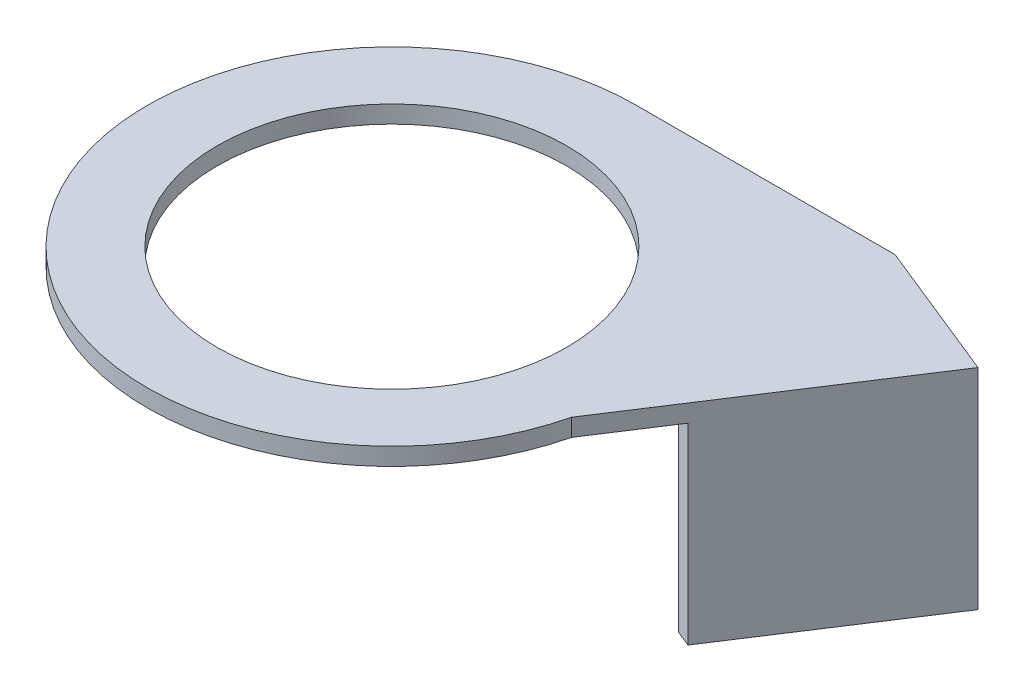
ISO-10303-21;
HEADER;
FILE_DESCRIPTION(('STEP AP214'),'2;1');
FILE_NAME('part.step','',(''),(''),'','','');
FILE_SCHEMA(('AUTOMOTIVE_DESIGN { 1 0 10303 214 1 1 1 1 }'));
ENDSEC;
DATA;
#1=APPLICATION_CONTEXT('core data for automotive mechanical design processes');
#2=APPLICATION_PROTOCOL_DEFINITION('international standard','automotive_design',2000,#1);
#3=PRODUCT_CONTEXT('',#1,'mechanical');
#4=PRODUCT('Part','Part','',(#3));
#5=PRODUCT_RELATED_PRODUCT_CATEGORY('part','',(#4));
#6=PRODUCT_DEFINITION_FORMATION('','',#4);
#7=PRODUCT_DEFINITION_CONTEXT('part definition',#1,'design');
#8=PRODUCT_DEFINITION('design','',#6,#7);
#9=PRODUCT_DEFINITION_SHAPE('','',#8);
#10=(LENGTH_UNIT() NAMED_UNIT(*) SI_UNIT(.MILLI.,.METRE.));
#11=(NAMED_UNIT(*) PLANE_ANGLE_UNIT() SI_UNIT($,.RADIAN.));
#12=(NAMED_UNIT(*) SI_UNIT($,.STERADIAN.) SOLID_ANGLE_UNIT());
#13=UNCERTAINTY_MEASURE_WITH_UNIT(LENGTH_MEASURE(1.E-05),#10,'distance_accuracy_value','');
#14=(GEOMETRIC_REPRESENTATION_CONTEXT(3) GLOBAL_UNCERTAINTY_ASSIGNED_CONTEXT((#13)) GLOBAL_UNIT_ASSIGNED_CONTEXT((#10,
#11,#12)) REPRESENTATION_CONTEXT('',''));
#15=CARTESIAN_POINT('',(0.,0.,0.));
#16=DIRECTION('',(0.,0.,1.));
#17=DIRECTION('',(1.,0.,0.));
#18=AXIS2_PLACEMENT_3D('',#15,#16,#17);
#19=CARTESIAN_POINT('',(0.,0.,0.));
#20=DIRECTION('',(0.,1.,0.));
#21=DIRECTION('',(0.,0.,1.));
#22=AXIS2_PLACEMENT_3D('',#19,#20,#21);
#23=PLANE('',#22);
#24=CARTESIAN_POINT('',(0.,0.,0.));
#25=DIRECTION('',(0.,-1.,0.));
#26=DIRECTION('',(0.,0.,-1.));
#27=AXIS2_PLACEMENT_3D('',#24,#25,#26);
#28=CIRCLE('',#27,10.);
#29=CARTESIAN_POINT('',(0.,0.,-10.));
#30=VERTEX_POINT('',#29);
#31=EDGE_CURVE('E222',#30,#30,#28,.T.);
#32=ORIENTED_EDGE('',*,*,#31,.F.);
#33=EDGE_LOOP('',(#32));
#34=FACE_BOUND('',#33,.T.);
#35=DIRECTION('',(-0.54530871216818,0.,0.838235294194584));
#36=VECTOR('',#35,1.);
#37=CARTESIAN_POINT('',(18.0654455202048,0.,-12.6812464511924));
#38=LINE('',#37,#36);
#39=CARTESIAN_POINT('',(18.0654455202048,0.,-12.6812464511924));
#40=VERTEX_POINT('',#39);
#41=CARTESIAN_POINT('',(14.3981507814312,0.,-7.04397014208761));
#42=VERTEX_POINT('',#41);
#43=EDGE_CURVE('E58',#40,#42,#38,.T.);
#44=ORIENTED_EDGE('',*,*,#43,.F.);
#45=DIRECTION('',(0.927024810886958,0.,0.375));
#46=VECTOR('',#45,1.);
#47=CARTESIAN_POINT('',(6.94888956123912,0.,-17.1781147503522));
#48=LINE('',#47,#46);
#49=CARTESIAN_POINT('',(21.8432232979826,0.,-11.1530600962757));
#50=VERTEX_POINT('',#49);
#51=EDGE_CURVE('E135',#40,#50,#48,.T.);
#52=ORIENTED_EDGE('',*,*,#51,.T.);
#53=DIRECTION('',(0.545308712286446,0.,-0.838235294117647));
#54=VECTOR('',#53,1.);
#55=CARTESIAN_POINT('',(21.8432232979826,0.,-11.1530600962757));
#56=LINE('',#55,#54);
#57=CARTESIAN_POINT('',(15.2995187505453,0.,-1.09423656686396));
#58=VERTEX_POINT('',#57);
#59=EDGE_CURVE('E139',#58,#50,#56,.T.);
#60=ORIENTED_EDGE('',*,*,#59,.F.);
#61=DIRECTION('',(-0.927024810886958,0.,-0.375000000000001));
#62=VECTOR('',#61,1.);
#63=CARTESIAN_POINT('',(16.2265435614322,0.,-0.71923656686396));
#64=LINE('',#63,#62);
#65=CARTESIAN_POINT('',(16.2265435614322,0.,-0.71923656686396));
#66=VERTEX_POINT('',#65);
#67=EDGE_CURVE('E136',#66,#58,#64,.T.);
#68=ORIENTED_EDGE('',*,*,#67,.F.);
#69=DIRECTION('',(-0.545308712286446,0.,0.838235294117647));
#70=VECTOR('',#69,1.);
#71=CARTESIAN_POINT('',(11.0726318569349,0.,7.20323119522517));
#72=LINE('',#71,#70);
#73=CARTESIAN_POINT('',(13.6017289923673,0.,3.31556457005365));
#74=VERTEX_POINT('',#73);
#75=EDGE_CURVE('E181',#66,#74,#72,.T.);
#76=ORIENTED_EDGE('',*,*,#75,.T.);
#77=CARTESIAN_POINT('',(0.,0.,0.));
#78=DIRECTION('',(0.,1.,0.));
#79=DIRECTION('',(0.,0.,1.));
#80=AXIS2_PLACEMENT_3D('',#77,#78,#79);
#81=CIRCLE('',#80,14.);
#82=CARTESIAN_POINT('',(0.,0.,-14.));
#83=VERTEX_POINT('',#82);
#84=EDGE_CURVE('E165',#83,#74,#81,.T.);
#85=ORIENTED_EDGE('',*,*,#84,.F.);
#86=DIRECTION('',(1.,0.,0.));
#87=VECTOR('',#86,1.);
#88=CARTESIAN_POINT('',(0.,0.,-14.));
#89=LINE('',#88,#87);
#90=CARTESIAN_POINT('',(7.80539949569854,0.,-14.));
#91=VERTEX_POINT('',#90);
#92=EDGE_CURVE('E169',#83,#91,#89,.T.);
#93=ORIENTED_EDGE('',*,*,#92,.T.);
#94=CARTESIAN_POINT('',(0.,0.,0.));
#95=DIRECTION('',(0.,1.,0.));
#96=DIRECTION('',(0.,0.,-1.));
#97=AXIS2_PLACEMENT_3D('',#94,#95,#96);
#98=CIRCLE('',#97,16.0288571422747);
#99=EDGE_CURVE('E54',#42,#91,#98,.T.);
#100=ORIENTED_EDGE('',*,*,#99,.F.);
#101=EDGE_LOOP('',(#44,#52,#60,#68,#76,#85,#93,#100));
#102=FACE_BOUND('',#101,.T.);
#103=ADVANCED_FACE('F38',(#34,#102),#23,.F.);
#104=CARTESIAN_POINT('',(0.,1.,0.));
#105=DIRECTION('',(0.,-1.,0.));
#106=DIRECTION('',(0.,0.,-1.));
#107=AXIS2_PLACEMENT_3D('',#104,#105,#106);
#108=CYLINDRICAL_SURFACE('',#107,14.);
#109=ORIENTED_EDGE('',*,*,#84,.T.);
#110=DIRECTION('',(0.,-1.,0.));
#111=VECTOR('',#110,1.);
#112=CARTESIAN_POINT('',(13.6017289923673,1.,3.31556457005365));
#113=LINE('',#112,#111);
#114=CARTESIAN_POINT('',(13.6017289923673,1.,3.31556457005365));
#115=VERTEX_POINT('',#114);
#116=EDGE_CURVE('E11',#115,#74,#113,.T.);
#117=ORIENTED_EDGE('',*,*,#116,.F.);
#118=CARTESIAN_POINT('',(0.,1.,0.));
#119=DIRECTION('',(0.,1.,0.));
#120=DIRECTION('',(0.,0.,1.));
#121=AXIS2_PLACEMENT_3D('',#118,#119,#120);
#122=CIRCLE('',#121,14.);
#123=CARTESIAN_POINT('',(0.,1.,-14.));
#124=VERTEX_POINT('',#123);
#125=EDGE_CURVE('E166',#124,#115,#122,.T.);
#126=ORIENTED_EDGE('',*,*,#125,.F.);
#127=DIRECTION('',(0.,-1.,0.));
#128=VECTOR('',#127,1.);
#129=CARTESIAN_POINT('',(0.,1.,-14.));
#130=LINE('',#129,#128);
#131=EDGE_CURVE('E178',#124,#83,#130,.T.);
#132=ORIENTED_EDGE('',*,*,#131,.T.);
#133=EDGE_LOOP('',(#109,#117,#126,#132));
#134=FACE_BOUND('',#133,.T.);
#135=ADVANCED_FACE('F40',(#134),#108,.T.);
#136=CARTESIAN_POINT('',(11.0726318569349,1.,7.20323119522517));
#137=DIRECTION('',(0.838235294117647,0.,0.545308712286446));
#138=DIRECTION('',(0.545308712286446,0.,-0.838235294117647));
#139=AXIS2_PLACEMENT_3D('',#136,#137,#138);
#140=PLANE('',#139);
#141=ORIENTED_EDGE('',*,*,#75,.F.);
#142=DIRECTION('',(0.,1.,0.));
#143=VECTOR('',#142,1.);
#144=CARTESIAN_POINT('',(16.2265435614322,-11.,-0.71923656686396));
#145=LINE('',#144,#143);
#146=CARTESIAN_POINT('',(16.2265435614322,-11.,-0.71923656686396));
#147=VERTEX_POINT('',#146);
#148=EDGE_CURVE('E162',#147,#66,#145,.T.);
#149=ORIENTED_EDGE('',*,*,#148,.F.);
#150=DIRECTION('',(-0.545308712286445,0.,0.838235294117647));
#151=VECTOR('',#150,1.);
#152=CARTESIAN_POINT('',(22.7702481088696,-11.,-10.7780600962757));
#153=LINE('',#152,#151);
#154=CARTESIAN_POINT('',(22.7702481088696,-11.,-10.7780600962757));
#155=VERTEX_POINT('',#154);
#156=EDGE_CURVE('E145',#155,#147,#153,.T.);
#157=ORIENTED_EDGE('',*,*,#156,.F.);
#158=DIRECTION('',(0.,-1.,0.));
#159=VECTOR('',#158,1.);
#160=CARTESIAN_POINT('',(22.7702481088696,1.00000000000003,-10.7780600962757));
#161=LINE('',#160,#159);
#162=CARTESIAN_POINT('',(22.7702481088696,1.00000000000003,-10.7780600962757));
#163=VERTEX_POINT('',#162);
#164=EDGE_CURVE('E47',#163,#155,#161,.T.);
#165=ORIENTED_EDGE('',*,*,#164,.F.);
#166=DIRECTION('',(-0.545308712286446,0.,0.838235294117647));
#167=VECTOR('',#166,1.);
#168=CARTESIAN_POINT('',(11.0726318569349,1.,7.20323119522517));
#169=LINE('',#168,#167);
#170=EDGE_CURVE('E168',#163,#115,#169,.T.);
#171=ORIENTED_EDGE('',*,*,#170,.T.);
#172=ORIENTED_EDGE('',*,*,#116,.T.);
#173=EDGE_LOOP('',(#141,#149,#157,#165,#171,#172));
#174=FACE_BOUND('',#173,.T.);
#175=ADVANCED_FACE('F199',(#174),#140,.T.);
#176=CARTESIAN_POINT('',(6.94888956123912,1.,-17.1781147503522));
#177=DIRECTION('',(0.375,0.,-0.927024810886958));
#178=DIRECTION('',(-0.927024810886958,0.,-0.375));
#179=AXIS2_PLACEMENT_3D('',#176,#177,#178);
#180=PLANE('',#179);
#181=ORIENTED_EDGE('',*,*,#51,.F.);
#182=DIRECTION('',(0.,1.,0.));
#183=VECTOR('',#182,1.);
#184=CARTESIAN_POINT('',(18.0654455202048,-11.,-12.6812464511924));
#185=LINE('',#184,#183);
#186=CARTESIAN_POINT('',(18.0654455202048,-11.,-12.6812464511924));
#187=VERTEX_POINT('',#186);
#188=EDGE_CURVE('E118',#187,#40,#185,.T.);
#189=ORIENTED_EDGE('',*,*,#188,.F.);
#190=DIRECTION('',(0.927024810886958,0.,0.375));
#191=VECTOR('',#190,1.);
#192=CARTESIAN_POINT('',(18.0654455202048,-11.,-12.6812464511924));
#193=LINE('',#192,#191);
#194=CARTESIAN_POINT('',(14.8053994956985,-11.,-14.));
#195=VERTEX_POINT('',#194);
#196=EDGE_CURVE('E124',#195,#187,#193,.T.);
#197=ORIENTED_EDGE('',*,*,#196,.F.);
#198=DIRECTION('',(0.,-1.,0.));
#199=VECTOR('',#198,1.);
#200=CARTESIAN_POINT('',(14.8053994956985,1.00000000000003,-14.));
#201=LINE('',#200,#199);
#202=CARTESIAN_POINT('',(14.8053994956985,1.00000000000003,-14.));
#203=VERTEX_POINT('',#202);
#204=EDGE_CURVE('E186',#203,#195,#201,.T.);
#205=ORIENTED_EDGE('',*,*,#204,.F.);
#206=DIRECTION('',(0.927024810886958,0.,0.375));
#207=VECTOR('',#206,1.);
#208=CARTESIAN_POINT('',(6.94888956123912,1.,-17.1781147503522));
#209=LINE('',#208,#207);
#210=EDGE_CURVE('E172',#203,#163,#209,.T.);
#211=ORIENTED_EDGE('',*,*,#210,.T.);
#212=ORIENTED_EDGE('',*,*,#164,.T.);
#213=DIRECTION('',(0.927024810886958,0.,0.375000000000001));
#214=VECTOR('',#213,1.);
#215=CARTESIAN_POINT('',(22.7702481088696,-11.,-10.7780600962757));
#216=LINE('',#215,#214);
#217=CARTESIAN_POINT('',(21.8432232979826,-11.,-11.1530600962757));
#218=VERTEX_POINT('',#217);
#219=EDGE_CURVE('E152',#218,#155,#216,.T.);
#220=ORIENTED_EDGE('',*,*,#219,.F.);
#221=DIRECTION('',(0.,1.,0.));
#222=VECTOR('',#221,1.);
#223=CARTESIAN_POINT('',(21.8432232979826,-11.,-11.1530600962757));
#224=LINE('',#223,#222);
#225=EDGE_CURVE('E154',#218,#50,#224,.T.);
#226=ORIENTED_EDGE('',*,*,#225,.T.);
#227=EDGE_LOOP('',(#181,#189,#197,#205,#211,#212,#220,#226));
#228=FACE_BOUND('',#227,.T.);
#229=ADVANCED_FACE('F133',(#228),#180,.T.);
#230=CARTESIAN_POINT('',(0.,1.,-14.));
#231=DIRECTION('',(0.,0.,-1.));
#232=DIRECTION('',(-1.,0.,0.));
#233=AXIS2_PLACEMENT_3D('',#230,#231,#232);
#234=PLANE('',#233);
#235=ORIENTED_EDGE('',*,*,#92,.F.);
#236=ORIENTED_EDGE('',*,*,#131,.F.);
#237=DIRECTION('',(1.,0.,0.));
#238=VECTOR('',#237,1.);
#239=CARTESIAN_POINT('',(0.,1.,-14.));
#240=LINE('',#239,#238);
#241=EDGE_CURVE('E175',#124,#203,#240,.T.);
#242=ORIENTED_EDGE('',*,*,#241,.T.);
#243=ORIENTED_EDGE('',*,*,#204,.T.);
#244=DIRECTION('',(1.,0.,0.));
#245=VECTOR('',#244,1.);
#246=CARTESIAN_POINT('',(14.8053994956985,-11.,-14.));
#247=LINE('',#246,#245);
#248=CARTESIAN_POINT('',(7.80539949569854,-11.,-14.));
#249=VERTEX_POINT('',#248);
#250=EDGE_CURVE('E130',#249,#195,#247,.T.);
#251=ORIENTED_EDGE('',*,*,#250,.F.);
#252=DIRECTION('',(0.,1.,0.));
#253=VECTOR('',#252,1.);
#254=CARTESIAN_POINT('',(7.80539949569854,-11.,-14.));
#255=LINE('',#254,#253);
#256=EDGE_CURVE('E141',#249,#91,#255,.T.);
#257=ORIENTED_EDGE('',*,*,#256,.T.);
#258=EDGE_LOOP('',(#235,#236,#242,#243,#251,#257));
#259=FACE_BOUND('',#258,.T.);
#260=ADVANCED_FACE('F212',(#259),#234,.T.);
#261=CARTESIAN_POINT('',(0.,1.,0.));
#262=DIRECTION('',(0.,1.,0.));
#263=DIRECTION('',(0.,0.,1.));
#264=AXIS2_PLACEMENT_3D('',#261,#262,#263);
#265=PLANE('',#264);
#266=CARTESIAN_POINT('',(0.,1.,0.));
#267=DIRECTION('',(0.,1.,0.));
#268=DIRECTION('',(0.,0.,1.));
#269=AXIS2_PLACEMENT_3D('',#266,#267,#268);
#270=CIRCLE('',#269,10.);
#271=CARTESIAN_POINT('',(0.,1.,10.));
#272=VERTEX_POINT('',#271);
#273=EDGE_CURVE('E42',#272,#272,#270,.T.);
#274=ORIENTED_EDGE('',*,*,#273,.F.);
#275=EDGE_LOOP('',(#274));
#276=FACE_BOUND('',#275,.T.);
#277=ORIENTED_EDGE('',*,*,#125,.T.);
#278=ORIENTED_EDGE('',*,*,#170,.F.);
#279=ORIENTED_EDGE('',*,*,#210,.F.);
#280=ORIENTED_EDGE('',*,*,#241,.F.);
#281=EDGE_LOOP('',(#277,#278,#279,#280));
#282=FACE_BOUND('',#281,.T.);
#283=ADVANCED_FACE('F231',(#276,#282),#265,.T.);
#284=CARTESIAN_POINT('',(16.2265435614322,-11.,-0.71923656686396));
#285=DIRECTION('',(0.375000000000001,0.,-0.927024810886958));
#286=DIRECTION('',(-0.927024810886958,0.,-0.375000000000001));
#287=AXIS2_PLACEMENT_3D('',#284,#285,#286);
#288=PLANE('',#287);
#289=ORIENTED_EDGE('',*,*,#67,.T.);
#290=DIRECTION('',(0.,1.,0.));
#291=VECTOR('',#290,1.);
#292=CARTESIAN_POINT('',(15.2995187505453,-11.,-1.09423656686396));
#293=LINE('',#292,#291);
#294=CARTESIAN_POINT('',(15.2995187505453,-11.,-1.09423656686396));
#295=VERTEX_POINT('',#294);
#296=EDGE_CURVE('E159',#295,#58,#293,.T.);
#297=ORIENTED_EDGE('',*,*,#296,.F.);
#298=DIRECTION('',(-0.927024810886958,0.,-0.375000000000001));
#299=VECTOR('',#298,1.);
#300=CARTESIAN_POINT('',(16.2265435614322,-11.,-0.71923656686396));
#301=LINE('',#300,#299);
#302=EDGE_CURVE('E148',#147,#295,#301,.T.);
#303=ORIENTED_EDGE('',*,*,#302,.F.);
#304=ORIENTED_EDGE('',*,*,#148,.T.);
#305=EDGE_LOOP('',(#289,#297,#303,#304));
#306=FACE_BOUND('',#305,.T.);
#307=ADVANCED_FACE('F201',(#306),#288,.F.);
#308=CARTESIAN_POINT('',(21.8432232979826,-11.,-11.1530600962757));
#309=DIRECTION('',(0.838235294117647,0.,0.545308712286446));
#310=DIRECTION('',(0.545308712286446,0.,-0.838235294117647));
#311=AXIS2_PLACEMENT_3D('',#308,#309,#310);
#312=PLANE('',#311);
#313=ORIENTED_EDGE('',*,*,#59,.T.);
#314=ORIENTED_EDGE('',*,*,#225,.F.);
#315=DIRECTION('',(0.545308712286446,0.,-0.838235294117647));
#316=VECTOR('',#315,1.);
#317=CARTESIAN_POINT('',(21.8432232979826,-11.,-11.1530600962757));
#318=LINE('',#317,#316);
#319=EDGE_CURVE('E150',#295,#218,#318,.T.);
#320=ORIENTED_EDGE('',*,*,#319,.F.);
#321=ORIENTED_EDGE('',*,*,#296,.T.);
#322=EDGE_LOOP('',(#313,#314,#320,#321));
#323=FACE_BOUND('',#322,.T.);
#324=ADVANCED_FACE('F204',(#323),#312,.F.);
#325=CARTESIAN_POINT('',(0.,-11.,0.));
#326=DIRECTION('',(0.,-1.,0.));
#327=DIRECTION('',(0.,0.,-1.));
#328=AXIS2_PLACEMENT_3D('',#325,#326,#327);
#329=PLANE('',#328);
#330=ORIENTED_EDGE('',*,*,#156,.T.);
#331=ORIENTED_EDGE('',*,*,#302,.T.);
#332=ORIENTED_EDGE('',*,*,#319,.T.);
#333=ORIENTED_EDGE('',*,*,#219,.T.);
#334=EDGE_LOOP('',(#330,#331,#332,#333));
#335=FACE_BOUND('',#334,.T.);
#336=ADVANCED_FACE('F194',(#335),#329,.T.);
#337=CARTESIAN_POINT('',(18.0654455202048,-11.,-12.6812464511924));
#338=DIRECTION('',(-0.838235294194584,0.,-0.54530871216818));
#339=DIRECTION('',(-0.54530871216818,0.,0.838235294194584));
#340=AXIS2_PLACEMENT_3D('',#337,#338,#339);
#341=PLANE('',#340);
#342=ORIENTED_EDGE('',*,*,#43,.T.);
#343=DIRECTION('',(0.,1.,0.));
#344=VECTOR('',#343,1.);
#345=CARTESIAN_POINT('',(14.3981507814312,-11.,-7.04397014208761));
#346=LINE('',#345,#344);
#347=CARTESIAN_POINT('',(14.3981507814312,-11.,-7.04397014208761));
#348=VERTEX_POINT('',#347);
#349=EDGE_CURVE('E120',#348,#42,#346,.T.);
#350=ORIENTED_EDGE('',*,*,#349,.F.);
#351=DIRECTION('',(-0.54530871216818,0.,0.838235294194584));
#352=VECTOR('',#351,1.);
#353=CARTESIAN_POINT('',(18.0654455202048,-11.,-12.6812464511924));
#354=LINE('',#353,#352);
#355=EDGE_CURVE('E114',#187,#348,#354,.T.);
#356=ORIENTED_EDGE('',*,*,#355,.F.);
#357=ORIENTED_EDGE('',*,*,#188,.T.);
#358=EDGE_LOOP('',(#342,#350,#356,#357));
#359=FACE_BOUND('',#358,.T.);
#360=ADVANCED_FACE('F116',(#359),#341,.F.);
#361=CARTESIAN_POINT('',(0.,-11.,0.));
#362=DIRECTION('',(0.,1.,0.));
#363=DIRECTION('',(0.,0.,1.));
#364=AXIS2_PLACEMENT_3D('',#361,#362,#363);
#365=CYLINDRICAL_SURFACE('',#364,16.0288571422747);
#366=ORIENTED_EDGE('',*,*,#99,.T.);
#367=ORIENTED_EDGE('',*,*,#256,.F.);
#368=CARTESIAN_POINT('',(0.,-11.,0.));
#369=DIRECTION('',(0.,1.,0.));
#370=DIRECTION('',(0.,0.,-1.));
#371=AXIS2_PLACEMENT_3D('',#368,#369,#370);
#372=CIRCLE('',#371,16.0288571422747);
#373=EDGE_CURVE('E123',#348,#249,#372,.T.);
#374=ORIENTED_EDGE('',*,*,#373,.F.);
#375=ORIENTED_EDGE('',*,*,#349,.T.);
#376=EDGE_LOOP('',(#366,#367,#374,#375));
#377=FACE_BOUND('',#376,.T.);
#378=ADVANCED_FACE('F216',(#377),#365,.F.);
#379=CARTESIAN_POINT('',(0.,-11.,0.));
#380=DIRECTION('',(0.,-1.,0.));
#381=DIRECTION('',(0.,0.,-1.));
#382=AXIS2_PLACEMENT_3D('',#379,#380,#381);
#383=PLANE('',#382);
#384=ORIENTED_EDGE('',*,*,#196,.T.);
#385=ORIENTED_EDGE('',*,*,#355,.T.);
#386=ORIENTED_EDGE('',*,*,#373,.T.);
#387=ORIENTED_EDGE('',*,*,#250,.T.);
#388=EDGE_LOOP('',(#384,#385,#386,#387));
#389=FACE_BOUND('',#388,.T.);
#390=ADVANCED_FACE('F128',(#389),#383,.T.);
#391=CARTESIAN_POINT('',(0.,11.,0.));
#392=DIRECTION('',(0.,-1.,0.));
#393=DIRECTION('',(0.,0.,-1.));
#394=AXIS2_PLACEMENT_3D('',#391,#392,#393);
#395=CYLINDRICAL_SURFACE('',#394,10.);
#396=ORIENTED_EDGE('',*,*,#273,.T.);
#397=EDGE_LOOP('',(#396));
#398=FACE_BOUND('',#397,.T.);
#399=ORIENTED_EDGE('',*,*,#31,.T.);
#400=EDGE_LOOP('',(#399));
#401=FACE_BOUND('',#400,.T.);
#402=ADVANCED_FACE('F229',(#398,#401),#395,.F.);
#403=CLOSED_SHELL('',(#103,#135,#175,#229,#260,#283,#307,#324,#336,#360,#378,#390,#402));
#404=MANIFOLD_SOLID_BREP('B2',#403);
#405=ADVANCED_BREP_SHAPE_REPRESENTATION('',(#18,#404),#14);
#406=SHAPE_DEFINITION_REPRESENTATION(#9,#405);
ENDSEC;
END-ISO-10303-21;
